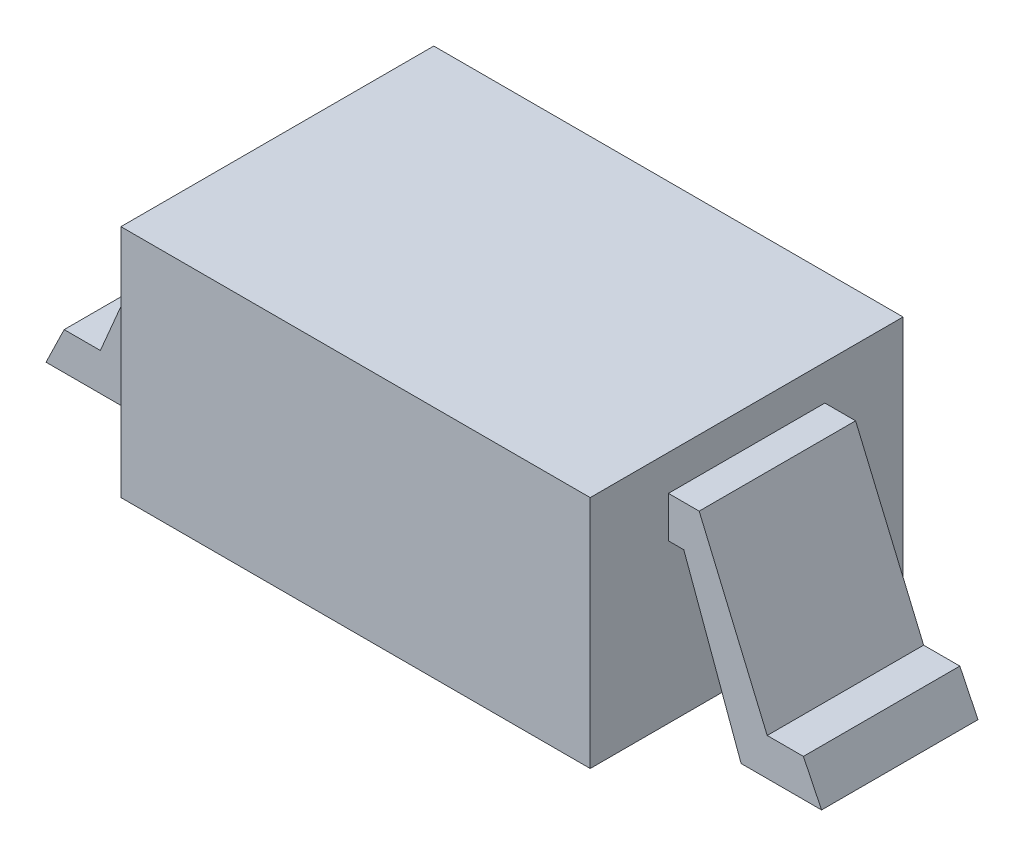
ISO-10303-21;
HEADER;
FILE_DESCRIPTION(('STEP AP214'),'2;1');
FILE_NAME('part.step','',(''),(''),'','','');
FILE_SCHEMA(('AUTOMOTIVE_DESIGN { 1 0 10303 214 1 1 1 1 }'));
ENDSEC;
DATA;
#1=APPLICATION_CONTEXT('core data for automotive mechanical design processes');
#2=APPLICATION_PROTOCOL_DEFINITION('international standard','automotive_design',2000,#1);
#3=PRODUCT_CONTEXT('',#1,'mechanical');
#4=PRODUCT('Part','Part','',(#3));
#5=PRODUCT_RELATED_PRODUCT_CATEGORY('part','',(#4));
#6=PRODUCT_DEFINITION_FORMATION('','',#4);
#7=PRODUCT_DEFINITION_CONTEXT('part definition',#1,'design');
#8=PRODUCT_DEFINITION('design','',#6,#7);
#9=PRODUCT_DEFINITION_SHAPE('','',#8);
#10=(LENGTH_UNIT() NAMED_UNIT(*) SI_UNIT(.MILLI.,.METRE.));
#11=(NAMED_UNIT(*) PLANE_ANGLE_UNIT() SI_UNIT($,.RADIAN.));
#12=(NAMED_UNIT(*) SI_UNIT($,.STERADIAN.) SOLID_ANGLE_UNIT());
#13=UNCERTAINTY_MEASURE_WITH_UNIT(LENGTH_MEASURE(1.E-05),#10,'distance_accuracy_value','');
#14=(GEOMETRIC_REPRESENTATION_CONTEXT(3) GLOBAL_UNCERTAINTY_ASSIGNED_CONTEXT((#13)) GLOBAL_UNIT_ASSIGNED_CONTEXT((#10,
#11,#12)) REPRESENTATION_CONTEXT('',''));
#15=CARTESIAN_POINT('',(0.,0.,0.));
#16=DIRECTION('',(0.,0.,1.));
#17=DIRECTION('',(1.,0.,0.));
#18=AXIS2_PLACEMENT_3D('',#15,#16,#17);
#19=CARTESIAN_POINT('',(6.,0.,4.));
#20=DIRECTION('',(-1.,0.,0.));
#21=DIRECTION('',(0.,-1.,0.));
#22=AXIS2_PLACEMENT_3D('',#19,#20,#21);
#23=PLANE('',#22);
#24=DIRECTION('',(0.,1.,0.));
#25=VECTOR('',#24,1.);
#26=CARTESIAN_POINT('',(6.,0.,0.));
#27=LINE('',#26,#25);
#28=CARTESIAN_POINT('',(6.,-3.,0.));
#29=VERTEX_POINT('',#28);
#30=CARTESIAN_POINT('',(6.,0.,0.));
#31=VERTEX_POINT('',#30);
#32=EDGE_CURVE('E276',#29,#31,#27,.T.);
#33=ORIENTED_EDGE('',*,*,#32,.T.);
#34=DIRECTION('',(0.,0.,-1.));
#35=VECTOR('',#34,1.);
#36=CARTESIAN_POINT('',(6.,0.,4.));
#37=LINE('',#36,#35);
#38=CARTESIAN_POINT('',(6.,0.,4.));
#39=VERTEX_POINT('',#38);
#40=EDGE_CURVE('E281',#39,#31,#37,.T.);
#41=ORIENTED_EDGE('',*,*,#40,.F.);
#42=DIRECTION('',(0.,1.,0.));
#43=VECTOR('',#42,1.);
#44=CARTESIAN_POINT('',(6.,0.,4.));
#45=LINE('',#44,#43);
#46=CARTESIAN_POINT('',(6.,-3.,4.));
#47=VERTEX_POINT('',#46);
#48=EDGE_CURVE('E267',#47,#39,#45,.T.);
#49=ORIENTED_EDGE('',*,*,#48,.F.);
#50=DIRECTION('',(0.,0.,-1.));
#51=VECTOR('',#50,1.);
#52=CARTESIAN_POINT('',(6.,-3.,4.));
#53=LINE('',#52,#51);
#54=EDGE_CURVE('E43',#47,#29,#53,.T.);
#55=ORIENTED_EDGE('',*,*,#54,.T.);
#56=EDGE_LOOP('',(#33,#41,#49,#55));
#57=FACE_BOUND('',#56,.T.);
#58=DIRECTION('',(0.,-1.,0.));
#59=VECTOR('',#58,1.);
#60=CARTESIAN_POINT('',(6.,-0.453225326529615,3.));
#61=LINE('',#60,#59);
#62=CARTESIAN_POINT('',(6.,-0.453225326529615,3.));
#63=VERTEX_POINT('',#62);
#64=CARTESIAN_POINT('',(6.,-0.979190926007345,3.));
#65=VERTEX_POINT('',#64);
#66=EDGE_CURVE('E566',#63,#65,#61,.T.);
#67=ORIENTED_EDGE('',*,*,#66,.F.);
#68=DIRECTION('',(0.,0.,-1.));
#69=VECTOR('',#68,1.);
#70=CARTESIAN_POINT('',(6.,-0.453225326529615,3.));
#71=LINE('',#70,#69);
#72=CARTESIAN_POINT('',(6.,-0.453225326529615,1.));
#73=VERTEX_POINT('',#72);
#74=EDGE_CURVE('E202',#63,#73,#71,.T.);
#75=ORIENTED_EDGE('',*,*,#74,.T.);
#76=DIRECTION('',(0.,-1.,0.));
#77=VECTOR('',#76,1.);
#78=CARTESIAN_POINT('',(6.,-0.453225326529615,1.));
#79=LINE('',#78,#77);
#80=CARTESIAN_POINT('',(6.,-0.979190926007345,1.));
#81=VERTEX_POINT('',#80);
#82=EDGE_CURVE('E540',#73,#81,#79,.T.);
#83=ORIENTED_EDGE('',*,*,#82,.T.);
#84=DIRECTION('',(0.,0.,-1.));
#85=VECTOR('',#84,1.);
#86=CARTESIAN_POINT('',(6.,-0.979190926007345,3.));
#87=LINE('',#86,#85);
#88=EDGE_CURVE('E561',#65,#81,#87,.T.);
#89=ORIENTED_EDGE('',*,*,#88,.F.);
#90=EDGE_LOOP('',(#67,#75,#83,#89));
#91=FACE_BOUND('',#90,.T.);
#92=ADVANCED_FACE('F35',(#57,#91),#23,.F.);
#93=CARTESIAN_POINT('',(0.,0.,4.));
#94=DIRECTION('',(1.,0.,0.));
#95=DIRECTION('',(0.,1.,0.));
#96=AXIS2_PLACEMENT_3D('',#93,#94,#95);
#97=PLANE('',#96);
#98=DIRECTION('',(0.,0.,-1.));
#99=VECTOR('',#98,1.);
#100=CARTESIAN_POINT('',(0.,-0.453225326529615,3.));
#101=LINE('',#100,#99);
#102=CARTESIAN_POINT('',(0.,-0.453225326529615,3.));
#103=VERTEX_POINT('',#102);
#104=CARTESIAN_POINT('',(0.,-0.453225326529615,1.));
#105=VERTEX_POINT('',#104);
#106=EDGE_CURVE('E58',#103,#105,#101,.T.);
#107=ORIENTED_EDGE('',*,*,#106,.F.);
#108=DIRECTION('',(0.,1.,0.));
#109=VECTOR('',#108,1.);
#110=CARTESIAN_POINT('',(0.,-0.453225326529615,3.));
#111=LINE('',#110,#109);
#112=CARTESIAN_POINT('',(0.,-0.979190926007345,3.));
#113=VERTEX_POINT('',#112);
#114=EDGE_CURVE('E206',#113,#103,#111,.T.);
#115=ORIENTED_EDGE('',*,*,#114,.F.);
#116=DIRECTION('',(0.,0.,-1.));
#117=VECTOR('',#116,1.);
#118=CARTESIAN_POINT('',(0.,-0.979190926007345,3.));
#119=LINE('',#118,#117);
#120=CARTESIAN_POINT('',(0.,-0.979190926007345,1.));
#121=VERTEX_POINT('',#120);
#122=EDGE_CURVE('E224',#113,#121,#119,.T.);
#123=ORIENTED_EDGE('',*,*,#122,.T.);
#124=DIRECTION('',(0.,1.,0.));
#125=VECTOR('',#124,1.);
#126=CARTESIAN_POINT('',(0.,-0.453225326529615,1.));
#127=LINE('',#126,#125);
#128=EDGE_CURVE('E198',#121,#105,#127,.T.);
#129=ORIENTED_EDGE('',*,*,#128,.T.);
#130=EDGE_LOOP('',(#107,#115,#123,#129));
#131=FACE_BOUND('',#130,.T.);
#132=DIRECTION('',(0.,-1.,0.));
#133=VECTOR('',#132,1.);
#134=CARTESIAN_POINT('',(0.,0.,0.));
#135=LINE('',#134,#133);
#136=CARTESIAN_POINT('',(0.,0.,0.));
#137=VERTEX_POINT('',#136);
#138=CARTESIAN_POINT('',(0.,-3.,0.));
#139=VERTEX_POINT('',#138);
#140=EDGE_CURVE('E260',#137,#139,#135,.T.);
#141=ORIENTED_EDGE('',*,*,#140,.T.);
#142=DIRECTION('',(0.,0.,-1.));
#143=VECTOR('',#142,1.);
#144=CARTESIAN_POINT('',(0.,-3.,4.));
#145=LINE('',#144,#143);
#146=CARTESIAN_POINT('',(0.,-3.,4.));
#147=VERTEX_POINT('',#146);
#148=EDGE_CURVE('E11',#147,#139,#145,.T.);
#149=ORIENTED_EDGE('',*,*,#148,.F.);
#150=DIRECTION('',(0.,-1.,0.));
#151=VECTOR('',#150,1.);
#152=CARTESIAN_POINT('',(0.,0.,4.));
#153=LINE('',#152,#151);
#154=CARTESIAN_POINT('',(0.,0.,4.));
#155=VERTEX_POINT('',#154);
#156=EDGE_CURVE('E261',#155,#147,#153,.T.);
#157=ORIENTED_EDGE('',*,*,#156,.F.);
#158=DIRECTION('',(0.,0.,-1.));
#159=VECTOR('',#158,1.);
#160=CARTESIAN_POINT('',(0.,0.,4.));
#161=LINE('',#160,#159);
#162=EDGE_CURVE('E271',#155,#137,#161,.T.);
#163=ORIENTED_EDGE('',*,*,#162,.T.);
#164=EDGE_LOOP('',(#141,#149,#157,#163));
#165=FACE_BOUND('',#164,.T.);
#166=ADVANCED_FACE('F37',(#131,#165),#97,.F.);
#167=CARTESIAN_POINT('',(0.,-3.,4.));
#168=DIRECTION('',(0.,1.,0.));
#169=DIRECTION('',(-1.,0.,0.));
#170=AXIS2_PLACEMENT_3D('',#167,#168,#169);
#171=PLANE('',#170);
#172=DIRECTION('',(1.,0.,0.));
#173=VECTOR('',#172,1.);
#174=CARTESIAN_POINT('',(0.,-3.,0.));
#175=LINE('',#174,#173);
#176=EDGE_CURVE('E274',#139,#29,#175,.T.);
#177=ORIENTED_EDGE('',*,*,#176,.T.);
#178=ORIENTED_EDGE('',*,*,#54,.F.);
#179=DIRECTION('',(1.,0.,0.));
#180=VECTOR('',#179,1.);
#181=CARTESIAN_POINT('',(0.,-3.,4.));
#182=LINE('',#181,#180);
#183=EDGE_CURVE('E264',#147,#47,#182,.T.);
#184=ORIENTED_EDGE('',*,*,#183,.F.);
#185=ORIENTED_EDGE('',*,*,#148,.T.);
#186=EDGE_LOOP('',(#177,#178,#184,#185));
#187=FACE_BOUND('',#186,.T.);
#188=ADVANCED_FACE('F304',(#187),#171,.F.);
#189=CARTESIAN_POINT('',(0.,0.,4.));
#190=DIRECTION('',(0.,-1.,0.));
#191=DIRECTION('',(0.,0.,-1.));
#192=AXIS2_PLACEMENT_3D('',#189,#190,#191);
#193=PLANE('',#192);
#194=DIRECTION('',(-1.,0.,0.));
#195=VECTOR('',#194,1.);
#196=CARTESIAN_POINT('',(0.,0.,0.));
#197=LINE('',#196,#195);
#198=EDGE_CURVE('E265',#31,#137,#197,.T.);
#199=ORIENTED_EDGE('',*,*,#198,.T.);
#200=ORIENTED_EDGE('',*,*,#162,.F.);
#201=DIRECTION('',(-1.,0.,0.));
#202=VECTOR('',#201,1.);
#203=CARTESIAN_POINT('',(0.,0.,4.));
#204=LINE('',#203,#202);
#205=EDGE_CURVE('E269',#39,#155,#204,.T.);
#206=ORIENTED_EDGE('',*,*,#205,.F.);
#207=ORIENTED_EDGE('',*,*,#40,.T.);
#208=EDGE_LOOP('',(#199,#200,#206,#207));
#209=FACE_BOUND('',#208,.T.);
#210=ADVANCED_FACE('F297',(#209),#193,.F.);
#211=CARTESIAN_POINT('',(0.,0.,4.));
#212=DIRECTION('',(0.,0.,1.));
#213=DIRECTION('',(1.,0.,0.));
#214=AXIS2_PLACEMENT_3D('',#211,#212,#213);
#215=PLANE('',#214);
#216=ORIENTED_EDGE('',*,*,#156,.T.);
#217=ORIENTED_EDGE('',*,*,#183,.T.);
#218=ORIENTED_EDGE('',*,*,#48,.T.);
#219=ORIENTED_EDGE('',*,*,#205,.T.);
#220=EDGE_LOOP('',(#216,#217,#218,#219));
#221=FACE_BOUND('',#220,.T.);
#222=ADVANCED_FACE('F303',(#221),#215,.T.);
#223=CARTESIAN_POINT('',(0.,0.,0.));
#224=DIRECTION('',(0.,0.,1.));
#225=DIRECTION('',(1.,0.,0.));
#226=AXIS2_PLACEMENT_3D('',#223,#224,#225);
#227=PLANE('',#226);
#228=ORIENTED_EDGE('',*,*,#140,.F.);
#229=ORIENTED_EDGE('',*,*,#198,.F.);
#230=ORIENTED_EDGE('',*,*,#32,.F.);
#231=ORIENTED_EDGE('',*,*,#176,.F.);
#232=EDGE_LOOP('',(#228,#229,#230,#231));
#233=FACE_BOUND('',#232,.T.);
#234=ADVANCED_FACE('F294',(#233),#227,.F.);
#235=CARTESIAN_POINT('',(0.,-0.453225326529615,3.));
#236=DIRECTION('',(0.,-1.,0.));
#237=DIRECTION('',(0.,0.,-1.));
#238=AXIS2_PLACEMENT_3D('',#235,#236,#237);
#239=PLANE('',#238);
#240=DIRECTION('',(-1.,0.,0.));
#241=VECTOR('',#240,1.);
#242=CARTESIAN_POINT('',(0.,-0.453225326529615,1.));
#243=LINE('',#242,#241);
#244=CARTESIAN_POINT('',(-0.392993769179868,-0.453225326529615,1.));
#245=VERTEX_POINT('',#244);
#246=EDGE_CURVE('E200',#105,#245,#243,.T.);
#247=ORIENTED_EDGE('',*,*,#246,.T.);
#248=DIRECTION('',(0.,0.,-1.));
#249=VECTOR('',#248,1.);
#250=CARTESIAN_POINT('',(-0.392993769179868,-0.453225326529615,3.));
#251=LINE('',#250,#249);
#252=CARTESIAN_POINT('',(-0.392993769179868,-0.453225326529615,3.));
#253=VERTEX_POINT('',#252);
#254=EDGE_CURVE('E256',#253,#245,#251,.T.);
#255=ORIENTED_EDGE('',*,*,#254,.F.);
#256=DIRECTION('',(-1.,0.,0.));
#257=VECTOR('',#256,1.);
#258=CARTESIAN_POINT('',(0.,-0.453225326529615,3.));
#259=LINE('',#258,#257);
#260=EDGE_CURVE('E209',#103,#253,#259,.T.);
#261=ORIENTED_EDGE('',*,*,#260,.F.);
#262=ORIENTED_EDGE('',*,*,#106,.T.);
#263=EDGE_LOOP('',(#247,#255,#261,#262));
#264=FACE_BOUND('',#263,.T.);
#265=ADVANCED_FACE('F318',(#264),#239,.F.);
#266=CARTESIAN_POINT('',(-0.392993769179868,-0.453225326529615,3.));
#267=DIRECTION('',(0.920499893954661,-0.390742812127693,0.));
#268=DIRECTION('',(0.390742812127693,0.920499893954661,0.));
#269=AXIS2_PLACEMENT_3D('',#266,#267,#268);
#270=PLANE('',#269);
#271=DIRECTION('',(-0.390742812127693,-0.920499893954661,0.));
#272=VECTOR('',#271,1.);
#273=CARTESIAN_POINT('',(-0.392993769179868,-0.453225326529615,1.));
#274=LINE('',#273,#272);
#275=CARTESIAN_POINT('',(-1.26294545295695,-2.50263073542754,1.));
#276=VERTEX_POINT('',#275);
#277=EDGE_CURVE('E227',#245,#276,#274,.T.);
#278=ORIENTED_EDGE('',*,*,#277,.T.);
#279=DIRECTION('',(0.,0.,-1.));
#280=VECTOR('',#279,1.);
#281=CARTESIAN_POINT('',(-1.26294545295695,-2.50263073542754,3.));
#282=LINE('',#281,#280);
#283=CARTESIAN_POINT('',(-1.26294545295695,-2.50263073542754,3.));
#284=VERTEX_POINT('',#283);
#285=EDGE_CURVE('E253',#284,#276,#282,.T.);
#286=ORIENTED_EDGE('',*,*,#285,.F.);
#287=DIRECTION('',(-0.390742812127693,-0.920499893954661,0.));
#288=VECTOR('',#287,1.);
#289=CARTESIAN_POINT('',(-0.392993769179868,-0.453225326529615,3.));
#290=LINE('',#289,#288);
#291=EDGE_CURVE('E212',#253,#284,#290,.T.);
#292=ORIENTED_EDGE('',*,*,#291,.F.);
#293=ORIENTED_EDGE('',*,*,#254,.T.);
#294=EDGE_LOOP('',(#278,#286,#292,#293));
#295=FACE_BOUND('',#294,.T.);
#296=ADVANCED_FACE('F323',(#295),#270,.F.);
#297=CARTESIAN_POINT('',(-1.26294545295695,-2.50263073542754,3.));
#298=DIRECTION('',(0.,-1.,0.));
#299=DIRECTION('',(0.,0.,-1.));
#300=AXIS2_PLACEMENT_3D('',#297,#298,#299);
#301=PLANE('',#300);
#302=DIRECTION('',(-1.,0.,0.));
#303=VECTOR('',#302,1.);
#304=CARTESIAN_POINT('',(-1.26294545295695,-2.50263073542754,1.));
#305=LINE('',#304,#303);
#306=CARTESIAN_POINT('',(-1.72561972524552,-2.50263073542754,1.));
#307=VERTEX_POINT('',#306);
#308=EDGE_CURVE('E229',#276,#307,#305,.T.);
#309=ORIENTED_EDGE('',*,*,#308,.T.);
#310=DIRECTION('',(0.,0.,-1.));
#311=VECTOR('',#310,1.);
#312=CARTESIAN_POINT('',(-1.72561972524552,-2.50263073542754,3.));
#313=LINE('',#312,#311);
#314=CARTESIAN_POINT('',(-1.72561972524552,-2.50263073542754,3.));
#315=VERTEX_POINT('',#314);
#316=EDGE_CURVE('E250',#315,#307,#313,.T.);
#317=ORIENTED_EDGE('',*,*,#316,.F.);
#318=DIRECTION('',(-1.,0.,0.));
#319=VECTOR('',#318,1.);
#320=CARTESIAN_POINT('',(-1.26294545295695,-2.50263073542754,3.));
#321=LINE('',#320,#319);
#322=EDGE_CURVE('E214',#284,#315,#321,.T.);
#323=ORIENTED_EDGE('',*,*,#322,.F.);
#324=ORIENTED_EDGE('',*,*,#285,.T.);
#325=EDGE_LOOP('',(#309,#317,#323,#324));
#326=FACE_BOUND('',#325,.T.);
#327=ADVANCED_FACE('F327',(#326),#301,.F.);
#328=CARTESIAN_POINT('',(-1.72561972524552,-2.50263073542754,3.));
#329=DIRECTION('',(0.899086184289505,-0.437771667904329,0.));
#330=DIRECTION('',(0.437771667904329,0.899086184289505,0.));
#331=AXIS2_PLACEMENT_3D('',#328,#329,#330);
#332=PLANE('',#331);
#333=DIRECTION('',(-0.437771667904329,-0.899086184289505,0.));
#334=VECTOR('',#333,1.);
#335=CARTESIAN_POINT('',(-1.72561972524552,-2.50263073542754,1.));
#336=LINE('',#335,#334);
#337=CARTESIAN_POINT('',(-1.9580167446416,-2.97992281421675,1.));
#338=VERTEX_POINT('',#337);
#339=EDGE_CURVE('E231',#307,#338,#336,.T.);
#340=ORIENTED_EDGE('',*,*,#339,.T.);
#341=DIRECTION('',(0.,0.,-1.));
#342=VECTOR('',#341,1.);
#343=CARTESIAN_POINT('',(-1.9580167446416,-2.97992281421675,3.));
#344=LINE('',#343,#342);
#345=CARTESIAN_POINT('',(-1.9580167446416,-2.97992281421675,3.));
#346=VERTEX_POINT('',#345);
#347=EDGE_CURVE('E247',#346,#338,#344,.T.);
#348=ORIENTED_EDGE('',*,*,#347,.F.);
#349=DIRECTION('',(-0.437771667904329,-0.899086184289505,0.));
#350=VECTOR('',#349,1.);
#351=CARTESIAN_POINT('',(-1.72561972524552,-2.50263073542754,3.));
#352=LINE('',#351,#350);
#353=EDGE_CURVE('E216',#315,#346,#352,.T.);
#354=ORIENTED_EDGE('',*,*,#353,.F.);
#355=ORIENTED_EDGE('',*,*,#316,.T.);
#356=EDGE_LOOP('',(#340,#348,#354,#355));
#357=FACE_BOUND('',#356,.T.);
#358=ADVANCED_FACE('F331',(#357),#332,.F.);
#359=CARTESIAN_POINT('',(-1.26294545295695,-2.97992281421675,3.));
#360=DIRECTION('',(0.,1.,0.));
#361=DIRECTION('',(0.,0.,1.));
#362=AXIS2_PLACEMENT_3D('',#359,#360,#361);
#363=PLANE('',#362);
#364=DIRECTION('',(1.,0.,0.));
#365=VECTOR('',#364,1.);
#366=CARTESIAN_POINT('',(-1.26294545295695,-2.97992281421675,1.));
#367=LINE('',#366,#365);
#368=CARTESIAN_POINT('',(-0.92927241962775,-2.97992281421675,1.));
#369=VERTEX_POINT('',#368);
#370=EDGE_CURVE('E234',#338,#369,#367,.T.);
#371=ORIENTED_EDGE('',*,*,#370,.T.);
#372=DIRECTION('',(0.,0.,-1.));
#373=VECTOR('',#372,1.);
#374=CARTESIAN_POINT('',(-0.92927241962775,-2.97992281421675,3.));
#375=LINE('',#374,#373);
#376=CARTESIAN_POINT('',(-0.92927241962775,-2.97992281421675,3.));
#377=VERTEX_POINT('',#376);
#378=EDGE_CURVE('E244',#377,#369,#375,.T.);
#379=ORIENTED_EDGE('',*,*,#378,.F.);
#380=DIRECTION('',(1.,0.,0.));
#381=VECTOR('',#380,1.);
#382=CARTESIAN_POINT('',(-1.9580167446416,-2.97992281421675,3.));
#383=LINE('',#382,#381);
#384=EDGE_CURVE('E218',#346,#377,#383,.T.);
#385=ORIENTED_EDGE('',*,*,#384,.F.);
#386=ORIENTED_EDGE('',*,*,#347,.T.);
#387=EDGE_LOOP('',(#371,#379,#385,#386));
#388=FACE_BOUND('',#387,.T.);
#389=ADVANCED_FACE('F335',(#388),#363,.F.);
#390=CARTESIAN_POINT('',(-0.92927241962775,-2.97992281421675,3.));
#391=DIRECTION('',(-0.93900157597896,0.34391283824398,0.));
#392=DIRECTION('',(-0.34391283824398,-0.93900157597896,0.));
#393=AXIS2_PLACEMENT_3D('',#390,#391,#392);
#394=PLANE('',#393);
#395=DIRECTION('',(0.34391283824398,0.93900157597896,0.));
#396=VECTOR('',#395,1.);
#397=CARTESIAN_POINT('',(-0.92927241962775,-2.97992281421675,1.));
#398=LINE('',#397,#396);
#399=CARTESIAN_POINT('',(-0.196496884589934,-0.979190926007345,1.));
#400=VERTEX_POINT('',#399);
#401=EDGE_CURVE('E236',#369,#400,#398,.T.);
#402=ORIENTED_EDGE('',*,*,#401,.T.);
#403=DIRECTION('',(0.,0.,-1.));
#404=VECTOR('',#403,1.);
#405=CARTESIAN_POINT('',(-0.196496884589934,-0.979190926007345,3.));
#406=LINE('',#405,#404);
#407=CARTESIAN_POINT('',(-0.196496884589934,-0.979190926007345,3.));
#408=VERTEX_POINT('',#407);
#409=EDGE_CURVE('E241',#408,#400,#406,.T.);
#410=ORIENTED_EDGE('',*,*,#409,.F.);
#411=DIRECTION('',(0.34391283824398,0.93900157597896,0.));
#412=VECTOR('',#411,1.);
#413=CARTESIAN_POINT('',(-0.92927241962775,-2.97992281421675,3.));
#414=LINE('',#413,#412);
#415=EDGE_CURVE('E220',#377,#408,#414,.T.);
#416=ORIENTED_EDGE('',*,*,#415,.F.);
#417=ORIENTED_EDGE('',*,*,#378,.T.);
#418=EDGE_LOOP('',(#402,#410,#416,#417));
#419=FACE_BOUND('',#418,.T.);
#420=ADVANCED_FACE('F339',(#419),#394,.F.);
#421=CARTESIAN_POINT('',(-0.196496884589934,-0.979190926007345,3.));
#422=DIRECTION('',(0.,1.,0.));
#423=DIRECTION('',(-1.,0.,0.));
#424=AXIS2_PLACEMENT_3D('',#421,#422,#423);
#425=PLANE('',#424);
#426=DIRECTION('',(1.,0.,0.));
#427=VECTOR('',#426,1.);
#428=CARTESIAN_POINT('',(-0.196496884589934,-0.979190926007345,1.));
#429=LINE('',#428,#427);
#430=EDGE_CURVE('E210',#400,#121,#429,.T.);
#431=ORIENTED_EDGE('',*,*,#430,.T.);
#432=ORIENTED_EDGE('',*,*,#122,.F.);
#433=DIRECTION('',(1.,0.,0.));
#434=VECTOR('',#433,1.);
#435=CARTESIAN_POINT('',(-0.196496884589934,-0.979190926007345,3.));
#436=LINE('',#435,#434);
#437=EDGE_CURVE('E222',#408,#113,#436,.T.);
#438=ORIENTED_EDGE('',*,*,#437,.F.);
#439=ORIENTED_EDGE('',*,*,#409,.T.);
#440=EDGE_LOOP('',(#431,#432,#438,#439));
#441=FACE_BOUND('',#440,.T.);
#442=ADVANCED_FACE('F343',(#441),#425,.F.);
#443=CARTESIAN_POINT('',(0.,0.,3.));
#444=DIRECTION('',(0.,0.,1.));
#445=DIRECTION('',(1.,0.,0.));
#446=AXIS2_PLACEMENT_3D('',#443,#444,#445);
#447=PLANE('',#446);
#448=ORIENTED_EDGE('',*,*,#114,.T.);
#449=ORIENTED_EDGE('',*,*,#260,.T.);
#450=ORIENTED_EDGE('',*,*,#291,.T.);
#451=ORIENTED_EDGE('',*,*,#322,.T.);
#452=ORIENTED_EDGE('',*,*,#353,.T.);
#453=ORIENTED_EDGE('',*,*,#384,.T.);
#454=ORIENTED_EDGE('',*,*,#415,.T.);
#455=ORIENTED_EDGE('',*,*,#437,.T.);
#456=EDGE_LOOP('',(#448,#449,#450,#451,#452,#453,#454,#455));
#457=FACE_BOUND('',#456,.T.);
#458=ADVANCED_FACE('F347',(#457),#447,.T.);
#459=CARTESIAN_POINT('',(0.,0.,1.));
#460=DIRECTION('',(0.,0.,1.));
#461=DIRECTION('',(1.,0.,0.));
#462=AXIS2_PLACEMENT_3D('',#459,#460,#461);
#463=PLANE('',#462);
#464=ORIENTED_EDGE('',*,*,#128,.F.);
#465=ORIENTED_EDGE('',*,*,#430,.F.);
#466=ORIENTED_EDGE('',*,*,#401,.F.);
#467=ORIENTED_EDGE('',*,*,#370,.F.);
#468=ORIENTED_EDGE('',*,*,#339,.F.);
#469=ORIENTED_EDGE('',*,*,#308,.F.);
#470=ORIENTED_EDGE('',*,*,#277,.F.);
#471=ORIENTED_EDGE('',*,*,#246,.F.);
#472=EDGE_LOOP('',(#464,#465,#466,#467,#468,#469,#470,#471));
#473=FACE_BOUND('',#472,.T.);
#474=ADVANCED_FACE('F349',(#473),#463,.F.);
#475=CARTESIAN_POINT('',(7.26294545295695,-2.50263073542754,3.));
#476=DIRECTION('',(0.,-1.,0.));
#477=DIRECTION('',(0.,0.,-1.));
#478=AXIS2_PLACEMENT_3D('',#475,#476,#477);
#479=PLANE('',#478);
#480=DIRECTION('',(-1.,0.,0.));
#481=VECTOR('',#480,1.);
#482=CARTESIAN_POINT('',(7.26294545295695,-2.50263073542754,1.));
#483=LINE('',#482,#481);
#484=CARTESIAN_POINT('',(7.72561972524552,-2.50263073542754,1.));
#485=VERTEX_POINT('',#484);
#486=CARTESIAN_POINT('',(7.26294545295695,-2.50263073542754,1.));
#487=VERTEX_POINT('',#486);
#488=EDGE_CURVE('E197',#485,#487,#483,.T.);
#489=ORIENTED_EDGE('',*,*,#488,.T.);
#490=DIRECTION('',(0.,0.,-1.));
#491=VECTOR('',#490,1.);
#492=CARTESIAN_POINT('',(7.26294545295695,-2.50263073542754,3.));
#493=LINE('',#492,#491);
#494=CARTESIAN_POINT('',(7.26294545295695,-2.50263073542754,3.));
#495=VERTEX_POINT('',#494);
#496=EDGE_CURVE('E177',#495,#487,#493,.T.);
#497=ORIENTED_EDGE('',*,*,#496,.F.);
#498=DIRECTION('',(-1.,0.,0.));
#499=VECTOR('',#498,1.);
#500=CARTESIAN_POINT('',(7.26294545295695,-2.50263073542754,3.));
#501=LINE('',#500,#499);
#502=CARTESIAN_POINT('',(7.72561972524552,-2.50263073542754,3.));
#503=VERTEX_POINT('',#502);
#504=EDGE_CURVE('E184',#503,#495,#501,.T.);
#505=ORIENTED_EDGE('',*,*,#504,.F.);
#506=DIRECTION('',(0.,0.,-1.));
#507=VECTOR('',#506,1.);
#508=CARTESIAN_POINT('',(7.72561972524552,-2.50263073542754,3.));
#509=LINE('',#508,#507);
#510=EDGE_CURVE('E550',#503,#485,#509,.T.);
#511=ORIENTED_EDGE('',*,*,#510,.T.);
#512=EDGE_LOOP('',(#489,#497,#505,#511));
#513=FACE_BOUND('',#512,.T.);
#514=ADVANCED_FACE('F195',(#513),#479,.F.);
#515=CARTESIAN_POINT('',(6.39299376917987,-0.453225326529615,3.));
#516=DIRECTION('',(-0.920499893954661,-0.390742812127693,0.));
#517=DIRECTION('',(0.390742812127693,-0.920499893954661,0.));
#518=AXIS2_PLACEMENT_3D('',#515,#516,#517);
#519=PLANE('',#518);
#520=DIRECTION('',(-0.390742812127693,0.920499893954661,0.));
#521=VECTOR('',#520,1.);
#522=CARTESIAN_POINT('',(6.39299376917987,-0.453225326529615,1.));
#523=LINE('',#522,#521);
#524=CARTESIAN_POINT('',(6.39299376917987,-0.453225326529615,1.));
#525=VERTEX_POINT('',#524);
#526=EDGE_CURVE('E532',#487,#525,#523,.T.);
#527=ORIENTED_EDGE('',*,*,#526,.T.);
#528=DIRECTION('',(0.,0.,-1.));
#529=VECTOR('',#528,1.);
#530=CARTESIAN_POINT('',(6.39299376917987,-0.453225326529615,3.));
#531=LINE('',#530,#529);
#532=CARTESIAN_POINT('',(6.39299376917987,-0.453225326529615,3.));
#533=VERTEX_POINT('',#532);
#534=EDGE_CURVE('E180',#533,#525,#531,.T.);
#535=ORIENTED_EDGE('',*,*,#534,.F.);
#536=DIRECTION('',(-0.390742812127693,0.920499893954661,0.));
#537=VECTOR('',#536,1.);
#538=CARTESIAN_POINT('',(6.39299376917987,-0.453225326529615,3.));
#539=LINE('',#538,#537);
#540=EDGE_CURVE('E173',#495,#533,#539,.T.);
#541=ORIENTED_EDGE('',*,*,#540,.F.);
#542=ORIENTED_EDGE('',*,*,#496,.T.);
#543=EDGE_LOOP('',(#527,#535,#541,#542));
#544=FACE_BOUND('',#543,.T.);
#545=ADVANCED_FACE('F175',(#544),#519,.F.);
#546=CARTESIAN_POINT('',(6.,-0.453225326529615,3.));
#547=DIRECTION('',(0.,-1.,0.));
#548=DIRECTION('',(0.,0.,-1.));
#549=AXIS2_PLACEMENT_3D('',#546,#547,#548);
#550=PLANE('',#549);
#551=DIRECTION('',(-1.,0.,0.));
#552=VECTOR('',#551,1.);
#553=CARTESIAN_POINT('',(6.,-0.453225326529615,1.));
#554=LINE('',#553,#552);
#555=EDGE_CURVE('E534',#525,#73,#554,.T.);
#556=ORIENTED_EDGE('',*,*,#555,.T.);
#557=ORIENTED_EDGE('',*,*,#74,.F.);
#558=DIRECTION('',(-1.,0.,0.));
#559=VECTOR('',#558,1.);
#560=CARTESIAN_POINT('',(6.,-0.453225326529615,3.));
#561=LINE('',#560,#559);
#562=EDGE_CURVE('E183',#533,#63,#561,.T.);
#563=ORIENTED_EDGE('',*,*,#562,.F.);
#564=ORIENTED_EDGE('',*,*,#534,.T.);
#565=EDGE_LOOP('',(#556,#557,#563,#564));
#566=FACE_BOUND('',#565,.T.);
#567=ADVANCED_FACE('F360',(#566),#550,.F.);
#568=CARTESIAN_POINT('',(6.19649688458993,-0.979190926007345,3.));
#569=DIRECTION('',(0.,1.,0.));
#570=DIRECTION('',(-1.,0.,0.));
#571=AXIS2_PLACEMENT_3D('',#568,#569,#570);
#572=PLANE('',#571);
#573=DIRECTION('',(1.,0.,0.));
#574=VECTOR('',#573,1.);
#575=CARTESIAN_POINT('',(6.19649688458993,-0.979190926007345,1.));
#576=LINE('',#575,#574);
#577=CARTESIAN_POINT('',(6.19649688458993,-0.979190926007345,1.));
#578=VERTEX_POINT('',#577);
#579=EDGE_CURVE('E50',#81,#578,#576,.T.);
#580=ORIENTED_EDGE('',*,*,#579,.T.);
#581=DIRECTION('',(0.,0.,-1.));
#582=VECTOR('',#581,1.);
#583=CARTESIAN_POINT('',(6.19649688458993,-0.979190926007345,3.));
#584=LINE('',#583,#582);
#585=CARTESIAN_POINT('',(6.19649688458993,-0.979190926007345,3.));
#586=VERTEX_POINT('',#585);
#587=EDGE_CURVE('E558',#586,#578,#584,.T.);
#588=ORIENTED_EDGE('',*,*,#587,.F.);
#589=DIRECTION('',(1.,0.,0.));
#590=VECTOR('',#589,1.);
#591=CARTESIAN_POINT('',(6.19649688458993,-0.979190926007345,3.));
#592=LINE('',#591,#590);
#593=EDGE_CURVE('E568',#65,#586,#592,.T.);
#594=ORIENTED_EDGE('',*,*,#593,.F.);
#595=ORIENTED_EDGE('',*,*,#88,.T.);
#596=EDGE_LOOP('',(#580,#588,#594,#595));
#597=FACE_BOUND('',#596,.T.);
#598=ADVANCED_FACE('F363',(#597),#572,.F.);
#599=CARTESIAN_POINT('',(6.92927241962775,-2.97992281421675,3.));
#600=DIRECTION('',(0.93900157597896,0.343912838243981,0.));
#601=DIRECTION('',(-0.343912838243981,0.93900157597896,0.));
#602=AXIS2_PLACEMENT_3D('',#599,#600,#601);
#603=PLANE('',#602);
#604=DIRECTION('',(0.343912838243981,-0.93900157597896,0.));
#605=VECTOR('',#604,1.);
#606=CARTESIAN_POINT('',(6.92927241962775,-2.97992281421675,1.));
#607=LINE('',#606,#605);
#608=CARTESIAN_POINT('',(6.92927241962775,-2.97992281421675,1.));
#609=VERTEX_POINT('',#608);
#610=EDGE_CURVE('E544',#578,#609,#607,.T.);
#611=ORIENTED_EDGE('',*,*,#610,.T.);
#612=DIRECTION('',(0.,0.,-1.));
#613=VECTOR('',#612,1.);
#614=CARTESIAN_POINT('',(6.92927241962775,-2.97992281421675,3.));
#615=LINE('',#614,#613);
#616=CARTESIAN_POINT('',(6.92927241962775,-2.97992281421675,3.));
#617=VERTEX_POINT('',#616);
#618=EDGE_CURVE('E555',#617,#609,#615,.T.);
#619=ORIENTED_EDGE('',*,*,#618,.F.);
#620=DIRECTION('',(0.343912838243981,-0.93900157597896,0.));
#621=VECTOR('',#620,1.);
#622=CARTESIAN_POINT('',(6.92927241962775,-2.97992281421675,3.));
#623=LINE('',#622,#621);
#624=EDGE_CURVE('E572',#586,#617,#623,.T.);
#625=ORIENTED_EDGE('',*,*,#624,.F.);
#626=ORIENTED_EDGE('',*,*,#587,.T.);
#627=EDGE_LOOP('',(#611,#619,#625,#626));
#628=FACE_BOUND('',#627,.T.);
#629=ADVANCED_FACE('F367',(#628),#603,.F.);
#630=CARTESIAN_POINT('',(7.9580167446416,-2.97992281421675,3.));
#631=DIRECTION('',(0.,1.,0.));
#632=DIRECTION('',(0.,0.,1.));
#633=AXIS2_PLACEMENT_3D('',#630,#631,#632);
#634=PLANE('',#633);
#635=DIRECTION('',(1.,0.,0.));
#636=VECTOR('',#635,1.);
#637=CARTESIAN_POINT('',(7.9580167446416,-2.97992281421675,1.));
#638=LINE('',#637,#636);
#639=CARTESIAN_POINT('',(7.9580167446416,-2.97992281421675,1.));
#640=VERTEX_POINT('',#639);
#641=EDGE_CURVE('E547',#609,#640,#638,.T.);
#642=ORIENTED_EDGE('',*,*,#641,.T.);
#643=DIRECTION('',(0.,0.,-1.));
#644=VECTOR('',#643,1.);
#645=CARTESIAN_POINT('',(7.9580167446416,-2.97992281421675,3.));
#646=LINE('',#645,#644);
#647=CARTESIAN_POINT('',(7.9580167446416,-2.97992281421675,3.));
#648=VERTEX_POINT('',#647);
#649=EDGE_CURVE('E552',#648,#640,#646,.T.);
#650=ORIENTED_EDGE('',*,*,#649,.F.);
#651=DIRECTION('',(1.,0.,0.));
#652=VECTOR('',#651,1.);
#653=CARTESIAN_POINT('',(7.26294545295695,-2.97992281421675,3.));
#654=LINE('',#653,#652);
#655=EDGE_CURVE('E573',#617,#648,#654,.T.);
#656=ORIENTED_EDGE('',*,*,#655,.F.);
#657=ORIENTED_EDGE('',*,*,#618,.T.);
#658=EDGE_LOOP('',(#642,#650,#656,#657));
#659=FACE_BOUND('',#658,.T.);
#660=ADVANCED_FACE('F371',(#659),#634,.F.);
#661=CARTESIAN_POINT('',(7.72561972524552,-2.50263073542754,3.));
#662=DIRECTION('',(-0.899086184289506,-0.437771667904327,0.));
#663=DIRECTION('',(0.437771667904327,-0.899086184289506,0.));
#664=AXIS2_PLACEMENT_3D('',#661,#662,#663);
#665=PLANE('',#664);
#666=DIRECTION('',(-0.437771667904327,0.899086184289506,0.));
#667=VECTOR('',#666,1.);
#668=CARTESIAN_POINT('',(7.72561972524552,-2.50263073542754,1.));
#669=LINE('',#668,#667);
#670=EDGE_CURVE('E193',#640,#485,#669,.T.);
#671=ORIENTED_EDGE('',*,*,#670,.T.);
#672=ORIENTED_EDGE('',*,*,#510,.F.);
#673=DIRECTION('',(-0.437771667904327,0.899086184289506,0.));
#674=VECTOR('',#673,1.);
#675=CARTESIAN_POINT('',(7.72561972524552,-2.50263073542754,3.));
#676=LINE('',#675,#674);
#677=EDGE_CURVE('E189',#648,#503,#676,.T.);
#678=ORIENTED_EDGE('',*,*,#677,.F.);
#679=ORIENTED_EDGE('',*,*,#649,.T.);
#680=EDGE_LOOP('',(#671,#672,#678,#679));
#681=FACE_BOUND('',#680,.T.);
#682=ADVANCED_FACE('F375',(#681),#665,.F.);
#683=CARTESIAN_POINT('',(0.,0.,3.));
#684=DIRECTION('',(0.,0.,-1.));
#685=DIRECTION('',(-1.,0.,0.));
#686=AXIS2_PLACEMENT_3D('',#683,#684,#685);
#687=PLANE('',#686);
#688=ORIENTED_EDGE('',*,*,#504,.T.);
#689=ORIENTED_EDGE('',*,*,#540,.T.);
#690=ORIENTED_EDGE('',*,*,#562,.T.);
#691=ORIENTED_EDGE('',*,*,#66,.T.);
#692=ORIENTED_EDGE('',*,*,#593,.T.);
#693=ORIENTED_EDGE('',*,*,#624,.T.);
#694=ORIENTED_EDGE('',*,*,#655,.T.);
#695=ORIENTED_EDGE('',*,*,#677,.T.);
#696=EDGE_LOOP('',(#688,#689,#690,#691,#692,#693,#694,#695));
#697=FACE_BOUND('',#696,.T.);
#698=ADVANCED_FACE('F187',(#697),#687,.F.);
#699=CARTESIAN_POINT('',(0.,0.,1.));
#700=DIRECTION('',(0.,0.,-1.));
#701=DIRECTION('',(-1.,0.,0.));
#702=AXIS2_PLACEMENT_3D('',#699,#700,#701);
#703=PLANE('',#702);
#704=ORIENTED_EDGE('',*,*,#488,.F.);
#705=ORIENTED_EDGE('',*,*,#670,.F.);
#706=ORIENTED_EDGE('',*,*,#641,.F.);
#707=ORIENTED_EDGE('',*,*,#610,.F.);
#708=ORIENTED_EDGE('',*,*,#579,.F.);
#709=ORIENTED_EDGE('',*,*,#82,.F.);
#710=ORIENTED_EDGE('',*,*,#555,.F.);
#711=ORIENTED_EDGE('',*,*,#526,.F.);
#712=EDGE_LOOP('',(#704,#705,#706,#707,#708,#709,#710,#711));
#713=FACE_BOUND('',#712,.T.);
#714=ADVANCED_FACE('F380',(#713),#703,.T.);
#715=CLOSED_SHELL('',(#92,#166,#188,#210,#222,#234,#265,#296,#327,#358,#389,#420,#442,#458,#474,
#514,#545,#567,#598,#629,#660,#682,#698,#714));
#716=MANIFOLD_SOLID_BREP('B2',#715);
#717=ADVANCED_BREP_SHAPE_REPRESENTATION('',(#18,#716),#14);
#718=SHAPE_DEFINITION_REPRESENTATION(#9,#717);
ENDSEC;
END-ISO-10303-21;
